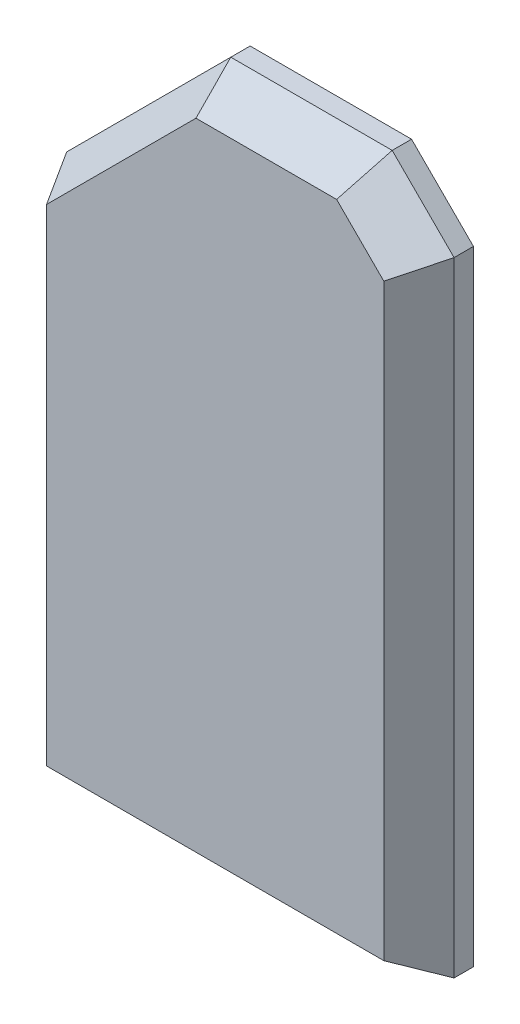
ISO-10303-21;
HEADER;
FILE_DESCRIPTION(('STEP AP214'),'2;1');
FILE_NAME('part.step','',(''),(''),'','','');
FILE_SCHEMA(('AUTOMOTIVE_DESIGN { 1 0 10303 214 1 1 1 1 }'));
ENDSEC;
DATA;
#1=APPLICATION_CONTEXT('core data for automotive mechanical design processes');
#2=APPLICATION_PROTOCOL_DEFINITION('international standard','automotive_design',2000,#1);
#3=PRODUCT_CONTEXT('',#1,'mechanical');
#4=PRODUCT('Part','Part','',(#3));
#5=PRODUCT_RELATED_PRODUCT_CATEGORY('part','',(#4));
#6=PRODUCT_DEFINITION_FORMATION('','',#4);
#7=PRODUCT_DEFINITION_CONTEXT('part definition',#1,'design');
#8=PRODUCT_DEFINITION('design','',#6,#7);
#9=PRODUCT_DEFINITION_SHAPE('','',#8);
#10=(LENGTH_UNIT() NAMED_UNIT(*) SI_UNIT(.MILLI.,.METRE.));
#11=(NAMED_UNIT(*) PLANE_ANGLE_UNIT() SI_UNIT($,.RADIAN.));
#12=(NAMED_UNIT(*) SI_UNIT($,.STERADIAN.) SOLID_ANGLE_UNIT());
#13=UNCERTAINTY_MEASURE_WITH_UNIT(LENGTH_MEASURE(1.E-05),#10,'distance_accuracy_value','');
#14=(GEOMETRIC_REPRESENTATION_CONTEXT(3) GLOBAL_UNCERTAINTY_ASSIGNED_CONTEXT((#13)) GLOBAL_UNIT_ASSIGNED_CONTEXT((#10,
#11,#12)) REPRESENTATION_CONTEXT('',''));
#15=CARTESIAN_POINT('',(0.,0.,0.));
#16=DIRECTION('',(0.,0.,1.));
#17=DIRECTION('',(1.,0.,0.));
#18=AXIS2_PLACEMENT_3D('',#15,#16,#17);
#19=CARTESIAN_POINT('',(2.18879816578761,-26.0024777075569,-3.));
#20=DIRECTION('',(0.,-1.,0.));
#21=DIRECTION('',(1.,0.,0.));
#22=AXIS2_PLACEMENT_3D('',#19,#20,#21);
#23=PLANE('',#22);
#24=DIRECTION('',(1.,0.,0.));
#25=VECTOR('',#24,1.);
#26=CARTESIAN_POINT('',(2.18879816578761,-26.0024777075569,0.));
#27=LINE('',#26,#25);
#28=CARTESIAN_POINT('',(-57.8112018342124,-26.0024777075569,0.));
#29=VERTEX_POINT('',#28);
#30=CARTESIAN_POINT('',(2.18879816578761,-26.0024777075569,0.));
#31=VERTEX_POINT('',#30);
#32=EDGE_CURVE('E136',#29,#31,#27,.T.);
#33=ORIENTED_EDGE('',*,*,#32,.F.);
#34=DIRECTION('',(0.,0.,1.));
#35=VECTOR('',#34,1.);
#36=CARTESIAN_POINT('',(-57.8112018342124,-26.0024777075569,-3.));
#37=LINE('',#36,#35);
#38=CARTESIAN_POINT('',(-57.8112018342124,-26.0024777075569,-3.));
#39=VERTEX_POINT('',#38);
#40=EDGE_CURVE('E11',#39,#29,#37,.T.);
#41=ORIENTED_EDGE('',*,*,#40,.F.);
#42=DIRECTION('',(1.,0.,0.));
#43=VECTOR('',#42,1.);
#44=CARTESIAN_POINT('',(2.18879816578761,-26.0024777075569,-3.));
#45=LINE('',#44,#43);
#46=CARTESIAN_POINT('',(2.18879816578761,-26.0024777075569,-3.));
#47=VERTEX_POINT('',#46);
#48=EDGE_CURVE('E157',#39,#47,#45,.T.);
#49=ORIENTED_EDGE('',*,*,#48,.T.);
#50=DIRECTION('',(0.,0.,1.));
#51=VECTOR('',#50,1.);
#52=CARTESIAN_POINT('',(2.18879816578761,-26.0024777075569,-3.));
#53=LINE('',#52,#51);
#54=EDGE_CURVE('E48',#47,#31,#53,.T.);
#55=ORIENTED_EDGE('',*,*,#54,.T.);
#56=EDGE_LOOP('',(#33,#41,#49,#55));
#57=FACE_BOUND('',#56,.T.);
#58=ADVANCED_FACE('F45',(#57),#23,.T.);
#59=CARTESIAN_POINT('',(-57.8112018342124,-26.0024777075569,-3.));
#60=DIRECTION('',(-1.,0.,0.));
#61=DIRECTION('',(0.,0.,1.));
#62=AXIS2_PLACEMENT_3D('',#59,#60,#61);
#63=PLANE('',#62);
#64=DIRECTION('',(0.,-1.,0.));
#65=VECTOR('',#64,1.);
#66=CARTESIAN_POINT('',(-57.8112018342124,-26.0024777075569,0.));
#67=LINE('',#66,#65);
#68=CARTESIAN_POINT('',(-57.8112018342124,54.8033911197721,0.));
#69=VERTEX_POINT('',#68);
#70=EDGE_CURVE('E154',#69,#29,#67,.T.);
#71=ORIENTED_EDGE('',*,*,#70,.F.);
#72=DIRECTION('',(0.,0.,1.));
#73=VECTOR('',#72,1.);
#74=CARTESIAN_POINT('',(-57.8112018342124,54.8033911197721,-3.));
#75=LINE('',#74,#73);
#76=CARTESIAN_POINT('',(-57.8112018342124,54.8033911197721,-3.));
#77=VERTEX_POINT('',#76);
#78=EDGE_CURVE('E55',#77,#69,#75,.T.);
#79=ORIENTED_EDGE('',*,*,#78,.F.);
#80=DIRECTION('',(0.,-1.,0.));
#81=VECTOR('',#80,1.);
#82=CARTESIAN_POINT('',(-57.8112018342124,-26.0024777075569,-3.));
#83=LINE('',#82,#81);
#84=EDGE_CURVE('E122',#77,#39,#83,.T.);
#85=ORIENTED_EDGE('',*,*,#84,.T.);
#86=ORIENTED_EDGE('',*,*,#40,.T.);
#87=EDGE_LOOP('',(#71,#79,#85,#86));
#88=FACE_BOUND('',#87,.T.);
#89=ADVANCED_FACE('F267',(#88),#63,.T.);
#90=CARTESIAN_POINT('',(-57.8112018342124,54.8033911197721,-3.));
#91=DIRECTION('',(-0.707106781186549,0.707106781186545,0.));
#92=DIRECTION('',(-0.707106781186545,-0.70710678118655,0.));
#93=AXIS2_PLACEMENT_3D('',#90,#91,#92);
#94=PLANE('',#93);
#95=DIRECTION('',(-0.707106781186545,-0.70710678118655,0.));
#96=VECTOR('',#95,1.);
#97=CARTESIAN_POINT('',(-57.8112018342124,54.8033911197721,0.));
#98=LINE('',#97,#96);
#99=CARTESIAN_POINT('',(-32.3980887208,80.2165042331847,0.));
#100=VERTEX_POINT('',#99);
#101=EDGE_CURVE('E110',#100,#69,#98,.T.);
#102=ORIENTED_EDGE('',*,*,#101,.F.);
#103=DIRECTION('',(0.,0.,1.));
#104=VECTOR('',#103,1.);
#105=CARTESIAN_POINT('',(-32.3980887208,80.2165042331847,-3.));
#106=LINE('',#105,#104);
#107=CARTESIAN_POINT('',(-32.3980887208,80.2165042331847,-3.));
#108=VERTEX_POINT('',#107);
#109=EDGE_CURVE('E84',#108,#100,#106,.T.);
#110=ORIENTED_EDGE('',*,*,#109,.F.);
#111=DIRECTION('',(-0.707106781186545,-0.70710678118655,0.));
#112=VECTOR('',#111,1.);
#113=CARTESIAN_POINT('',(-57.8112018342124,54.8033911197721,-3.));
#114=LINE('',#113,#112);
#115=EDGE_CURVE('E107',#108,#77,#114,.T.);
#116=ORIENTED_EDGE('',*,*,#115,.T.);
#117=ORIENTED_EDGE('',*,*,#78,.T.);
#118=EDGE_LOOP('',(#102,#110,#116,#117));
#119=FACE_BOUND('',#118,.T.);
#120=ADVANCED_FACE('F106',(#119),#94,.T.);
#121=CARTESIAN_POINT('',(-32.3980887208,80.2165042331847,-3.));
#122=DIRECTION('',(0.,1.,0.));
#123=DIRECTION('',(-1.,0.,0.));
#124=AXIS2_PLACEMENT_3D('',#121,#122,#123);
#125=PLANE('',#124);
#126=DIRECTION('',(-1.,0.,0.));
#127=VECTOR('',#126,1.);
#128=CARTESIAN_POINT('',(-32.3980887208,80.2165042331847,0.));
#129=LINE('',#128,#127);
#130=CARTESIAN_POINT('',(-7.39808872079998,80.2165042331847,0.));
#131=VERTEX_POINT('',#130);
#132=EDGE_CURVE('E149',#131,#100,#129,.T.);
#133=ORIENTED_EDGE('',*,*,#132,.F.);
#134=DIRECTION('',(0.,0.,1.));
#135=VECTOR('',#134,1.);
#136=CARTESIAN_POINT('',(-7.39808872079998,80.2165042331847,-3.));
#137=LINE('',#136,#135);
#138=CARTESIAN_POINT('',(-7.39808872079998,80.2165042331847,-3.));
#139=VERTEX_POINT('',#138);
#140=EDGE_CURVE('E113',#139,#131,#137,.T.);
#141=ORIENTED_EDGE('',*,*,#140,.F.);
#142=DIRECTION('',(-1.,0.,0.));
#143=VECTOR('',#142,1.);
#144=CARTESIAN_POINT('',(-32.3980887208,80.2165042331847,-3.));
#145=LINE('',#144,#143);
#146=EDGE_CURVE('E119',#139,#108,#145,.T.);
#147=ORIENTED_EDGE('',*,*,#146,.T.);
#148=ORIENTED_EDGE('',*,*,#109,.T.);
#149=EDGE_LOOP('',(#133,#141,#147,#148));
#150=FACE_BOUND('',#149,.T.);
#151=ADVANCED_FACE('F125',(#150),#125,.T.);
#152=CARTESIAN_POINT('',(-7.39808872079998,80.2165042331847,-3.));
#153=DIRECTION('',(0.70710678118655,0.707106781186545,0.));
#154=DIRECTION('',(-0.707106781186545,0.70710678118655,0.));
#155=AXIS2_PLACEMENT_3D('',#152,#153,#154);
#156=PLANE('',#155);
#157=DIRECTION('',(-0.707106781186545,0.70710678118655,0.));
#158=VECTOR('',#157,1.);
#159=CARTESIAN_POINT('',(-7.39808872079998,80.2165042331847,0.));
#160=LINE('',#159,#158);
#161=CARTESIAN_POINT('',(2.18879816578761,70.629617346597,0.));
#162=VERTEX_POINT('',#161);
#163=EDGE_CURVE('E145',#162,#131,#160,.T.);
#164=ORIENTED_EDGE('',*,*,#163,.F.);
#165=DIRECTION('',(0.,0.,1.));
#166=VECTOR('',#165,1.);
#167=CARTESIAN_POINT('',(2.18879816578761,70.629617346597,-3.));
#168=LINE('',#167,#166);
#169=CARTESIAN_POINT('',(2.18879816578761,70.629617346597,-3.));
#170=VERTEX_POINT('',#169);
#171=EDGE_CURVE('E162',#170,#162,#168,.T.);
#172=ORIENTED_EDGE('',*,*,#171,.F.);
#173=DIRECTION('',(-0.707106781186545,0.70710678118655,0.));
#174=VECTOR('',#173,1.);
#175=CARTESIAN_POINT('',(-7.39808872079998,80.2165042331847,-3.));
#176=LINE('',#175,#174);
#177=EDGE_CURVE('E127',#170,#139,#176,.T.);
#178=ORIENTED_EDGE('',*,*,#177,.T.);
#179=ORIENTED_EDGE('',*,*,#140,.T.);
#180=EDGE_LOOP('',(#164,#172,#178,#179));
#181=FACE_BOUND('',#180,.T.);
#182=ADVANCED_FACE('F234',(#181),#156,.T.);
#183=CARTESIAN_POINT('',(2.18879816578761,70.629617346597,-3.));
#184=DIRECTION('',(1.,0.,0.));
#185=DIRECTION('',(0.,1.,0.));
#186=AXIS2_PLACEMENT_3D('',#183,#184,#185);
#187=PLANE('',#186);
#188=DIRECTION('',(0.,1.,0.));
#189=VECTOR('',#188,1.);
#190=CARTESIAN_POINT('',(2.18879816578761,70.629617346597,0.));
#191=LINE('',#190,#189);
#192=EDGE_CURVE('E140',#31,#162,#191,.T.);
#193=ORIENTED_EDGE('',*,*,#192,.F.);
#194=ORIENTED_EDGE('',*,*,#54,.F.);
#195=DIRECTION('',(0.,1.,0.));
#196=VECTOR('',#195,1.);
#197=CARTESIAN_POINT('',(2.18879816578761,70.629617346597,-3.));
#198=LINE('',#197,#196);
#199=EDGE_CURVE('E130',#47,#170,#198,.T.);
#200=ORIENTED_EDGE('',*,*,#199,.T.);
#201=ORIENTED_EDGE('',*,*,#171,.T.);
#202=EDGE_LOOP('',(#193,#194,#200,#201));
#203=FACE_BOUND('',#202,.T.);
#204=ADVANCED_FACE('F168',(#203),#187,.T.);
#205=CARTESIAN_POINT('',(0.,0.,-3.));
#206=DIRECTION('',(0.,0.,-1.));
#207=DIRECTION('',(-1.,0.,0.));
#208=AXIS2_PLACEMENT_3D('',#205,#206,#207);
#209=PLANE('',#208);
#210=CARTESIAN_POINT('',(-19.8980887208,56.224723903337,-3.));
#211=DIRECTION('',(0.,0.,-1.));
#212=DIRECTION('',(-1.,0.,0.));
#213=AXIS2_PLACEMENT_3D('',#210,#211,#212);
#214=CIRCLE('',#213,1.5);
#215=CARTESIAN_POINT('',(-21.3980887208,56.224723903337,-3.));
#216=VERTEX_POINT('',#215);
#217=EDGE_CURVE('E294',#216,#216,#214,.T.);
#218=ORIENTED_EDGE('',*,*,#217,.F.);
#219=EDGE_LOOP('',(#218));
#220=FACE_BOUND('',#219,.T.);
#221=ORIENTED_EDGE('',*,*,#48,.F.);
#222=ORIENTED_EDGE('',*,*,#84,.F.);
#223=ORIENTED_EDGE('',*,*,#115,.F.);
#224=ORIENTED_EDGE('',*,*,#146,.F.);
#225=ORIENTED_EDGE('',*,*,#177,.F.);
#226=ORIENTED_EDGE('',*,*,#199,.F.);
#227=EDGE_LOOP('',(#221,#222,#223,#224,#225,#226));
#228=FACE_BOUND('',#227,.T.);
#229=ADVANCED_FACE('F117',(#220,#228),#209,.T.);
#230=CARTESIAN_POINT('',(2.18879816578761,-26.0024777075569,0.));
#231=DIRECTION('',(0.,-0.874619707139396,0.484809620246337));
#232=DIRECTION('',(0.,-0.484809620246337,-0.874619707139396));
#233=AXIS2_PLACEMENT_3D('',#230,#231,#232);
#234=PLANE('',#233);
#235=ORIENTED_EDGE('',*,*,#32,.T.);
#236=DIRECTION('',(0.436245191128686,-0.436245191128686,-0.787007157803658));
#237=VECTOR('',#236,1.);
#238=CARTESIAN_POINT('',(-16.2012429709213,-7.61243657084799,33.1765124320289));
#239=LINE('',#238,#237);
#240=CARTESIAN_POINT('',(-1.69136519438177,-22.1223143473876,7.));
#241=VERTEX_POINT('',#240);
#242=EDGE_CURVE('E141',#241,#31,#239,.T.);
#243=ORIENTED_EDGE('',*,*,#242,.F.);
#244=DIRECTION('',(-1.,0.,0.));
#245=VECTOR('',#244,1.);
#246=CARTESIAN_POINT('',(0.,-22.1223143473876,7.));
#247=LINE('',#246,#245);
#248=CARTESIAN_POINT('',(-53.931038474043,-22.1223143473876,7.));
#249=VERTEX_POINT('',#248);
#250=EDGE_CURVE('E188',#249,#241,#247,.F.);
#251=ORIENTED_EDGE('',*,*,#250,.F.);
#252=DIRECTION('',(-0.436245191128686,-0.436245191128686,-0.787007157803658));
#253=VECTOR('',#252,1.);
#254=CARTESIAN_POINT('',(-46.3926098272381,-14.5838857005827,20.599685278542));
#255=LINE('',#254,#253);
#256=EDGE_CURVE('E187',#249,#29,#255,.T.);
#257=ORIENTED_EDGE('',*,*,#256,.T.);
#258=EDGE_LOOP('',(#235,#243,#251,#257));
#259=FACE_BOUND('',#258,.T.);
#260=ADVANCED_FACE('F185',(#259),#234,.T.);
#261=CARTESIAN_POINT('',(2.18879816578761,70.629617346597,0.));
#262=DIRECTION('',(0.874619707139396,0.,0.484809620246337));
#263=DIRECTION('',(0.484809620246337,0.,-0.874619707139396));
#264=AXIS2_PLACEMENT_3D('',#261,#262,#263);
#265=PLANE('',#264);
#266=ORIENTED_EDGE('',*,*,#192,.T.);
#267=DIRECTION('',(0.47532032746056,0.196884126105784,-0.857500569790101));
#268=VECTOR('',#267,1.);
#269=CARTESIAN_POINT('',(0.920008329475927,70.1040673885956,2.28895745610928));
#270=LINE('',#269,#268);
#271=CARTESIAN_POINT('',(-1.69136519438178,69.0224010585917,7.));
#272=VERTEX_POINT('',#271);
#273=EDGE_CURVE('E182',#272,#162,#270,.T.);
#274=ORIENTED_EDGE('',*,*,#273,.F.);
#275=DIRECTION('',(0.,-1.,0.));
#276=VECTOR('',#275,1.);
#277=CARTESIAN_POINT('',(-1.69136519438178,0.,7.));
#278=LINE('',#277,#276);
#279=EDGE_CURVE('E177',#241,#272,#278,.F.);
#280=ORIENTED_EDGE('',*,*,#279,.F.);
#281=ORIENTED_EDGE('',*,*,#242,.T.);
#282=EDGE_LOOP('',(#266,#274,#280,#281));
#283=FACE_BOUND('',#282,.T.);
#284=ADVANCED_FACE('F174',(#283),#265,.T.);
#285=CARTESIAN_POINT('',(-7.39808872079998,80.2165042331847,0.));
#286=DIRECTION('',(0.618449525877661,0.618449525877657,0.484809620246337));
#287=DIRECTION('',(-0.707106781186545,0.70710678118655,0.));
#288=AXIS2_PLACEMENT_3D('',#285,#286,#287);
#289=PLANE('',#288);
#290=ORIENTED_EDGE('',*,*,#163,.T.);
#291=DIRECTION('',(0.196884126105785,0.47532032746056,-0.857500569790101));
#292=VECTOR('',#291,1.);
#293=CARTESIAN_POINT('',(-8.36717269861095,77.876928550875,4.22070625795843));
#294=LINE('',#293,#292);
#295=CARTESIAN_POINT('',(-9.00530500880531,76.3363408730153,7.));
#296=VERTEX_POINT('',#295);
#297=EDGE_CURVE('E209',#296,#131,#294,.T.);
#298=ORIENTED_EDGE('',*,*,#297,.F.);
#299=DIRECTION('',(0.707106781186545,-0.70710678118655,0.));
#300=VECTOR('',#299,1.);
#301=CARTESIAN_POINT('',(33.665517932105,33.6655179321047,7.));
#302=LINE('',#301,#300);
#303=EDGE_CURVE('E220',#272,#296,#302,.F.);
#304=ORIENTED_EDGE('',*,*,#303,.F.);
#305=ORIENTED_EDGE('',*,*,#273,.T.);
#306=EDGE_LOOP('',(#290,#298,#304,#305));
#307=FACE_BOUND('',#306,.T.);
#308=ADVANCED_FACE('F237',(#307),#289,.T.);
#309=CARTESIAN_POINT('',(-32.3980887208,80.2165042331847,0.));
#310=DIRECTION('',(0.,0.874619707139396,0.484809620246337));
#311=DIRECTION('',(0.,-0.484809620246337,0.874619707139396));
#312=AXIS2_PLACEMENT_3D('',#309,#310,#311);
#313=PLANE('',#312);
#314=ORIENTED_EDGE('',*,*,#132,.T.);
#315=DIRECTION('',(-0.196884126105785,0.47532032746056,-0.857500569790101));
#316=VECTOR('',#315,1.);
#317=CARTESIAN_POINT('',(-31.0049502925032,76.8531705453274,6.06761458980764));
#318=LINE('',#317,#316);
#319=CARTESIAN_POINT('',(-30.7908724327947,76.3363408730153,7.));
#320=VERTEX_POINT('',#319);
#321=EDGE_CURVE('E199',#320,#100,#318,.T.);
#322=ORIENTED_EDGE('',*,*,#321,.F.);
#323=DIRECTION('',(1.,0.,0.));
#324=VECTOR('',#323,1.);
#325=CARTESIAN_POINT('',(0.,76.3363408730153,7.));
#326=LINE('',#325,#324);
#327=EDGE_CURVE('E224',#296,#320,#326,.F.);
#328=ORIENTED_EDGE('',*,*,#327,.F.);
#329=ORIENTED_EDGE('',*,*,#297,.T.);
#330=EDGE_LOOP('',(#314,#322,#328,#329));
#331=FACE_BOUND('',#330,.T.);
#332=ADVANCED_FACE('F242',(#331),#313,.T.);
#333=CARTESIAN_POINT('',(-57.8112018342124,54.8033911197721,0.));
#334=DIRECTION('',(-0.618449525877661,0.618449525877657,0.484809620246337));
#335=DIRECTION('',(-0.707106781186545,-0.70710678118655,0.));
#336=AXIS2_PLACEMENT_3D('',#333,#334,#335);
#337=PLANE('',#336);
#338=ORIENTED_EDGE('',*,*,#101,.T.);
#339=DIRECTION('',(-0.47532032746056,0.196884126105784,-0.857500569790101));
#340=VECTOR('',#339,1.);
#341=CARTESIAN_POINT('',(-50.2491440063594,51.6710842080258,13.6423134495709));
#342=LINE('',#341,#340);
#343=CARTESIAN_POINT('',(-53.931038474043,53.1961748317668,7.));
#344=VERTEX_POINT('',#343);
#345=EDGE_CURVE('E193',#344,#69,#342,.T.);
#346=ORIENTED_EDGE('',*,*,#345,.F.);
#347=DIRECTION('',(0.707106781186545,0.70710678118655,0.));
#348=VECTOR('',#347,1.);
#349=CARTESIAN_POINT('',(-53.5636066529051,53.5636066529047,7.));
#350=LINE('',#349,#348);
#351=EDGE_CURVE('E202',#320,#344,#350,.F.);
#352=ORIENTED_EDGE('',*,*,#351,.F.);
#353=ORIENTED_EDGE('',*,*,#321,.T.);
#354=EDGE_LOOP('',(#338,#346,#352,#353));
#355=FACE_BOUND('',#354,.T.);
#356=ADVANCED_FACE('F257',(#355),#337,.T.);
#357=CARTESIAN_POINT('',(-57.8112018342124,-26.0024777075569,0.));
#358=DIRECTION('',(-0.874619707139396,0.,0.484809620246337));
#359=DIRECTION('',(0.484809620246337,0.,0.874619707139396));
#360=AXIS2_PLACEMENT_3D('',#357,#358,#359);
#361=PLANE('',#360);
#362=ORIENTED_EDGE('',*,*,#70,.T.);
#363=ORIENTED_EDGE('',*,*,#256,.F.);
#364=DIRECTION('',(0.,1.,0.));
#365=VECTOR('',#364,1.);
#366=CARTESIAN_POINT('',(-53.931038474043,0.,7.));
#367=LINE('',#366,#365);
#368=EDGE_CURVE('E194',#344,#249,#367,.F.);
#369=ORIENTED_EDGE('',*,*,#368,.F.);
#370=ORIENTED_EDGE('',*,*,#345,.T.);
#371=EDGE_LOOP('',(#362,#363,#369,#370));
#372=FACE_BOUND('',#371,.T.);
#373=ADVANCED_FACE('F255',(#372),#361,.T.);
#374=CARTESIAN_POINT('',(0.,0.,7.));
#375=DIRECTION('',(0.,0.,-1.));
#376=DIRECTION('',(-1.,0.,0.));
#377=AXIS2_PLACEMENT_3D('',#374,#375,#376);
#378=PLANE('',#377);
#379=ORIENTED_EDGE('',*,*,#250,.T.);
#380=ORIENTED_EDGE('',*,*,#279,.T.);
#381=ORIENTED_EDGE('',*,*,#303,.T.);
#382=ORIENTED_EDGE('',*,*,#327,.T.);
#383=ORIENTED_EDGE('',*,*,#351,.T.);
#384=ORIENTED_EDGE('',*,*,#368,.T.);
#385=EDGE_LOOP('',(#379,#380,#381,#382,#383,#384));
#386=FACE_BOUND('',#385,.T.);
#387=ADVANCED_FACE('F249',(#386),#378,.F.);
#388=CARTESIAN_POINT('',(-19.8980887208,56.224723903337,0.));
#389=DIRECTION('',(0.,0.,-1.));
#390=DIRECTION('',(-1.,0.,0.));
#391=AXIS2_PLACEMENT_3D('',#388,#389,#390);
#392=CYLINDRICAL_SURFACE('',#391,1.5);
#393=CARTESIAN_POINT('',(-19.8980887208,56.224723903337,0.));
#394=DIRECTION('',(0.,0.,-1.));
#395=DIRECTION('',(-1.,0.,0.));
#396=AXIS2_PLACEMENT_3D('',#393,#394,#395);
#397=CIRCLE('',#396,1.5);
#398=CARTESIAN_POINT('',(-21.3980887208,56.224723903337,0.));
#399=VERTEX_POINT('',#398);
#400=EDGE_CURVE('E217',#399,#399,#397,.T.);
#401=ORIENTED_EDGE('',*,*,#400,.F.);
#402=EDGE_LOOP('',(#401));
#403=FACE_BOUND('',#402,.T.);
#404=ORIENTED_EDGE('',*,*,#217,.T.);
#405=EDGE_LOOP('',(#404));
#406=FACE_BOUND('',#405,.T.);
#407=ADVANCED_FACE('F304',(#403,#406),#392,.F.);
#408=CARTESIAN_POINT('',(-19.8980887208,56.224723903337,0.));
#409=DIRECTION('',(0.,0.,-1.));
#410=DIRECTION('',(-1.,0.,0.));
#411=AXIS2_PLACEMENT_3D('',#408,#409,#410);
#412=PLANE('',#411);
#413=ORIENTED_EDGE('',*,*,#400,.T.);
#414=EDGE_LOOP('',(#413));
#415=FACE_BOUND('',#414,.T.);
#416=ADVANCED_FACE('F302',(#415),#412,.T.);
#417=CLOSED_SHELL('',(#58,#89,#120,#151,#182,#204,#229,#260,#284,#308,#332,#356,#373,#387,#407,#416));
#418=MANIFOLD_SOLID_BREP('B2',#417);
#419=ADVANCED_BREP_SHAPE_REPRESENTATION('',(#18,#418),#14);
#420=SHAPE_DEFINITION_REPRESENTATION(#9,#419);
ENDSEC;
END-ISO-10303-21;
